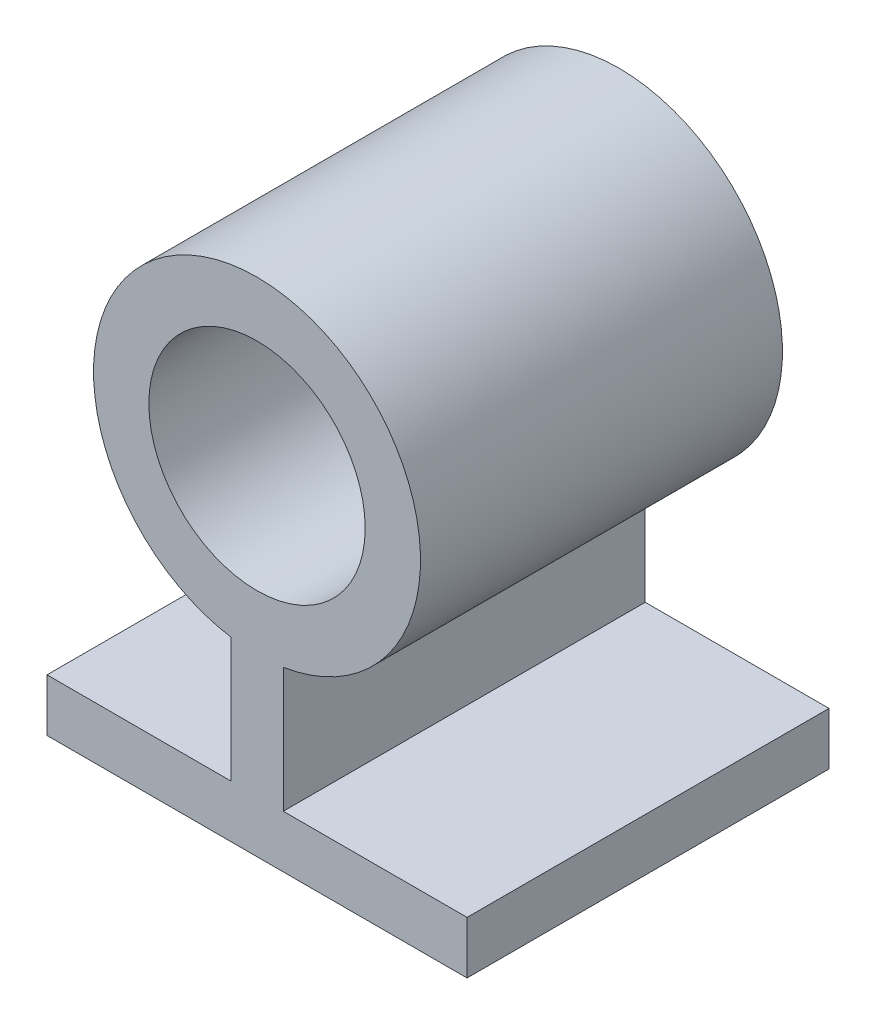
ISO-10303-21;
HEADER;
FILE_DESCRIPTION(('STEP AP214'),'2;1');
FILE_NAME('part.step','',(''),(''),'','','');
FILE_SCHEMA(('AUTOMOTIVE_DESIGN { 1 0 10303 214 1 1 1 1 }'));
ENDSEC;
DATA;
#1=APPLICATION_CONTEXT('core data for automotive mechanical design processes');
#2=APPLICATION_PROTOCOL_DEFINITION('international standard','automotive_design',2000,#1);
#3=PRODUCT_CONTEXT('',#1,'mechanical');
#4=PRODUCT('Part','Part','',(#3));
#5=PRODUCT_RELATED_PRODUCT_CATEGORY('part','',(#4));
#6=PRODUCT_DEFINITION_FORMATION('','',#4);
#7=PRODUCT_DEFINITION_CONTEXT('part definition',#1,'design');
#8=PRODUCT_DEFINITION('design','',#6,#7);
#9=PRODUCT_DEFINITION_SHAPE('','',#8);
#10=(LENGTH_UNIT() NAMED_UNIT(*) SI_UNIT(.MILLI.,.METRE.));
#11=(NAMED_UNIT(*) PLANE_ANGLE_UNIT() SI_UNIT($,.RADIAN.));
#12=(NAMED_UNIT(*) SI_UNIT($,.STERADIAN.) SOLID_ANGLE_UNIT());
#13=UNCERTAINTY_MEASURE_WITH_UNIT(LENGTH_MEASURE(1.E-05),#10,'distance_accuracy_value','');
#14=(GEOMETRIC_REPRESENTATION_CONTEXT(3) GLOBAL_UNCERTAINTY_ASSIGNED_CONTEXT((#13)) GLOBAL_UNIT_ASSIGNED_CONTEXT((#10,
#11,#12)) REPRESENTATION_CONTEXT('',''));
#15=CARTESIAN_POINT('',(0.,0.,0.));
#16=DIRECTION('',(0.,0.,1.));
#17=DIRECTION('',(1.,0.,0.));
#18=AXIS2_PLACEMENT_3D('',#15,#16,#17);
#19=CARTESIAN_POINT('',(0.,0.00125729107634131,-0.132602632502468));
#20=DIRECTION('',(0.,0.,1.));
#21=DIRECTION('',(1.,0.,0.));
#22=AXIS2_PLACEMENT_3D('',#19,#20,#21);
#23=CYLINDRICAL_SURFACE('',#22,3.14665);
#24=CARTESIAN_POINT('',(0.,0.00125729107634131,0.));
#25=DIRECTION('',(0.,0.,1.));
#26=DIRECTION('',(1.,0.,0.));
#27=AXIS2_PLACEMENT_3D('',#24,#25,#26);
#28=CIRCLE('',#27,3.14665);
#29=CARTESIAN_POINT('',(2.88708834641408,-1.25019270892366,0.));
#30=VERTEX_POINT('',#29);
#31=CARTESIAN_POINT('',(0.594395678399493,-3.08874270892366,0.));
#32=VERTEX_POINT('',#31);
#33=EDGE_CURVE('E365',#30,#32,#28,.F.);
#34=ORIENTED_EDGE('',*,*,#33,.T.);
#35=DIRECTION('',(0.,0.,1.));
#36=VECTOR('',#35,1.);
#37=CARTESIAN_POINT('',(0.594395678399493,-3.08874270892366,-0.132602632502468));
#38=LINE('',#37,#36);
#39=CARTESIAN_POINT('',(0.594395678399493,-3.08874270892366,3.52389736749753));
#40=VERTEX_POINT('',#39);
#41=EDGE_CURVE('E233',#32,#40,#38,.T.);
#42=ORIENTED_EDGE('',*,*,#41,.T.);
#43=CARTESIAN_POINT('',(0.,0.00125729107634131,3.52389736749753));
#44=DIRECTION('',(0.,0.,-1.));
#45=DIRECTION('',(-1.,0.,0.));
#46=AXIS2_PLACEMENT_3D('',#43,#44,#45);
#47=CIRCLE('',#46,3.14665);
#48=CARTESIAN_POINT('',(-0.594395678399496,-3.08874270892366,3.52389736749753));
#49=VERTEX_POINT('',#48);
#50=EDGE_CURVE('E380',#49,#40,#47,.T.);
#51=ORIENTED_EDGE('',*,*,#50,.F.);
#52=DIRECTION('',(0.,0.,1.));
#53=VECTOR('',#52,1.);
#54=CARTESIAN_POINT('',(-0.594395678399496,-3.08874270892366,-0.132602632502468));
#55=LINE('',#54,#53);
#56=CARTESIAN_POINT('',(-0.594395678399496,-3.08874270892366,0.));
#57=VERTEX_POINT('',#56);
#58=EDGE_CURVE('E236',#49,#57,#55,.F.);
#59=ORIENTED_EDGE('',*,*,#58,.T.);
#60=CARTESIAN_POINT('',(-2.88708834641408,-1.25019270892366,0.));
#61=VERTEX_POINT('',#60);
#62=EDGE_CURVE('E363',#57,#61,#28,.F.);
#63=ORIENTED_EDGE('',*,*,#62,.T.);
#64=DIRECTION('',(0.,0.,1.));
#65=VECTOR('',#64,1.);
#66=CARTESIAN_POINT('',(-2.88708834641408,-1.25019270892366,-0.132602632502468));
#67=LINE('',#66,#65);
#68=CARTESIAN_POINT('',(-2.88708834641408,-1.25019270892366,2.64839736749753));
#69=VERTEX_POINT('',#68);
#70=EDGE_CURVE('E388',#61,#69,#67,.T.);
#71=ORIENTED_EDGE('',*,*,#70,.T.);
#72=CARTESIAN_POINT('',(0.,0.00125729107634131,2.64839736749753));
#73=DIRECTION('',(0.,0.,1.));
#74=DIRECTION('',(1.,0.,0.));
#75=AXIS2_PLACEMENT_3D('',#72,#73,#74);
#76=CIRCLE('',#75,3.14665);
#77=CARTESIAN_POINT('',(-3.10674363602793,0.500807291076341,2.64839736749753));
#78=VERTEX_POINT('',#77);
#79=EDGE_CURVE('E356',#78,#69,#76,.T.);
#80=ORIENTED_EDGE('',*,*,#79,.F.);
#81=DIRECTION('',(0.,0.,1.));
#82=VECTOR('',#81,1.);
#83=CARTESIAN_POINT('',(-3.10674363602793,0.500807291076341,-0.132602632502468));
#84=LINE('',#83,#82);
#85=CARTESIAN_POINT('',(-3.10674363602793,0.500807291076341,0.));
#86=VERTEX_POINT('',#85);
#87=EDGE_CURVE('E383',#86,#78,#84,.T.);
#88=ORIENTED_EDGE('',*,*,#87,.F.);
#89=CARTESIAN_POINT('',(3.10674363602792,0.500807291076341,0.));
#90=VERTEX_POINT('',#89);
#91=EDGE_CURVE('E361',#86,#90,#28,.F.);
#92=ORIENTED_EDGE('',*,*,#91,.T.);
#93=DIRECTION('',(0.,0.,1.));
#94=VECTOR('',#93,1.);
#95=CARTESIAN_POINT('',(3.10674363602792,0.500807291076341,-0.132602632502468));
#96=LINE('',#95,#94);
#97=CARTESIAN_POINT('',(3.10674363602792,0.500807291076341,2.64839736749753));
#98=VERTEX_POINT('',#97);
#99=EDGE_CURVE('E385',#98,#90,#96,.F.);
#100=ORIENTED_EDGE('',*,*,#99,.F.);
#101=CARTESIAN_POINT('',(2.88708834641408,-1.25019270892366,2.64839736749753));
#102=VERTEX_POINT('',#101);
#103=EDGE_CURVE('E376',#102,#98,#76,.T.);
#104=ORIENTED_EDGE('',*,*,#103,.F.);
#105=DIRECTION('',(0.,0.,1.));
#106=VECTOR('',#105,1.);
#107=CARTESIAN_POINT('',(2.88708834641408,-1.25019270892366,-0.132602632502468));
#108=LINE('',#107,#106);
#109=EDGE_CURVE('E390',#102,#30,#108,.F.);
#110=ORIENTED_EDGE('',*,*,#109,.T.);
#111=EDGE_LOOP('',(#34,#42,#51,#59,#63,#71,#80,#88,#92,#100,#104,#110));
#112=FACE_BOUND('',#111,.T.);
#113=ADVANCED_FACE('F33',(#112),#23,.F.);
#114=CARTESIAN_POINT('',(0.,0.00125729107634131,3.52389736749753));
#115=DIRECTION('',(0.,0.,-1.));
#116=DIRECTION('',(-1.,0.,0.));
#117=AXIS2_PLACEMENT_3D('',#114,#115,#116);
#118=PLANE('',#117);
#119=ORIENTED_EDGE('',*,*,#50,.T.);
#120=DIRECTION('',(-1.,0.,0.));
#121=VECTOR('',#120,1.);
#122=CARTESIAN_POINT('',(0.,-3.08874270892366,3.52389736749753));
#123=LINE('',#122,#121);
#124=CARTESIAN_POINT('',(0.0881389702171581,-3.08874270892366,3.52389736749753));
#125=VERTEX_POINT('',#124);
#126=EDGE_CURVE('E230',#40,#125,#123,.T.);
#127=ORIENTED_EDGE('',*,*,#126,.T.);
#128=CARTESIAN_POINT('',(0.,0.,3.52389736749753));
#129=DIRECTION('',(0.,0.,-1.));
#130=DIRECTION('',(-1.,0.,0.));
#131=AXIS2_PLACEMENT_3D('',#128,#129,#130);
#132=CIRCLE('',#131,3.09);
#133=CARTESIAN_POINT('',(-0.0881389702171581,-3.08874270892366,3.52389736749753));
#134=VERTEX_POINT('',#133);
#135=EDGE_CURVE('E268',#134,#125,#132,.T.);
#136=ORIENTED_EDGE('',*,*,#135,.F.);
#137=EDGE_CURVE('E234',#134,#49,#123,.T.);
#138=ORIENTED_EDGE('',*,*,#137,.T.);
#139=EDGE_LOOP('',(#119,#127,#136,#138));
#140=FACE_BOUND('',#139,.T.);
#141=ADVANCED_FACE('F296',(#140),#118,.T.);
#142=CARTESIAN_POINT('',(0.,0.,13.4585371829633));
#143=DIRECTION('',(0.,0.,-1.));
#144=DIRECTION('',(-1.,0.,0.));
#145=AXIS2_PLACEMENT_3D('',#142,#143,#144);
#146=CYLINDRICAL_SURFACE('',#145,3.09);
#147=DIRECTION('',(0.,0.,-1.));
#148=VECTOR('',#147,1.);
#149=CARTESIAN_POINT('',(-0.0881389702171581,-3.08874270892366,13.4585371829633));
#150=LINE('',#149,#148);
#151=CARTESIAN_POINT('',(-0.0881300154276128,-3.08842864163243,4.71869736749753));
#152=VERTEX_POINT('',#151);
#153=EDGE_CURVE('E11',#134,#152,#150,.F.);
#154=ORIENTED_EDGE('',*,*,#153,.F.);
#155=ORIENTED_EDGE('',*,*,#135,.T.);
#156=DIRECTION('',(0.,0.,-1.));
#157=VECTOR('',#156,1.);
#158=CARTESIAN_POINT('',(0.0881389702171581,-3.08874270892366,13.4585371829633));
#159=LINE('',#158,#157);
#160=CARTESIAN_POINT('',(0.0881300154276159,-3.08842864163243,4.71869736749753));
#161=VERTEX_POINT('',#160);
#162=EDGE_CURVE('E42',#161,#125,#159,.T.);
#163=ORIENTED_EDGE('',*,*,#162,.F.);
#164=CARTESIAN_POINT('',(0.,0.,4.71869736749753));
#165=DIRECTION('',(0.,0.,1.));
#166=DIRECTION('',(0.0285239409404128,-0.999593109616722,0.));
#167=AXIS2_PLACEMENT_3D('',#164,#165,#166);
#168=CIRCLE('',#167,3.09);
#169=CARTESIAN_POINT('',(3.08999993605255,0.000628645542442329,4.71869736749753));
#170=VERTEX_POINT('',#169);
#171=EDGE_CURVE('E316',#161,#170,#168,.T.);
#172=ORIENTED_EDGE('',*,*,#171,.T.);
#173=CARTESIAN_POINT('',(0.,0.00125729107634131,4.71869736749753));
#174=DIRECTION('',(0.,0.,-1.));
#175=DIRECTION('',(-0.999999979305033,-0.000203445159366348,0.));
#176=AXIS2_PLACEMENT_3D('',#173,#174,#175);
#177=CIRCLE('',#176,3.09);
#178=CARTESIAN_POINT('',(-3.08999993605256,0.000628645533898983,4.71869736749753));
#179=VERTEX_POINT('',#178);
#180=EDGE_CURVE('E241',#179,#170,#177,.T.);
#181=ORIENTED_EDGE('',*,*,#180,.F.);
#182=CARTESIAN_POINT('',(0.,0.,4.71869736749753));
#183=DIRECTION('',(0.,0.,1.));
#184=DIRECTION('',(-0.999999979305034,0.000203445156601847,0.));
#185=AXIS2_PLACEMENT_3D('',#182,#183,#184);
#186=CIRCLE('',#185,3.09);
#187=EDGE_CURVE('E379',#179,#152,#186,.T.);
#188=ORIENTED_EDGE('',*,*,#187,.T.);
#189=EDGE_LOOP('',(#154,#155,#163,#172,#181,#188));
#190=FACE_BOUND('',#189,.T.);
#191=ADVANCED_FACE('F286',(#190),#146,.F.);
#192=CARTESIAN_POINT('',(0.,0.,10.34));
#193=DIRECTION('',(0.,0.,-1.));
#194=DIRECTION('',(-1.,0.,0.));
#195=AXIS2_PLACEMENT_3D('',#192,#193,#194);
#196=CYLINDRICAL_SURFACE('',#195,4.67);
#197=CARTESIAN_POINT('',(0.,0.,10.34));
#198=DIRECTION('',(0.,0.,1.));
#199=DIRECTION('',(1.,0.,0.));
#200=AXIS2_PLACEMENT_3D('',#197,#198,#199);
#201=CIRCLE('',#200,4.67);
#202=CARTESIAN_POINT('',(0.75,-4.60938173728321,10.34));
#203=VERTEX_POINT('',#202);
#204=CARTESIAN_POINT('',(-0.75,-4.60938173728321,10.34));
#205=VERTEX_POINT('',#204);
#206=EDGE_CURVE('E49',#203,#205,#201,.T.);
#207=ORIENTED_EDGE('',*,*,#206,.F.);
#208=DIRECTION('',(0.,0.,-1.));
#209=VECTOR('',#208,1.);
#210=CARTESIAN_POINT('',(0.75,-4.60938173728321,10.34));
#211=LINE('',#210,#209);
#212=CARTESIAN_POINT('',(0.75,-4.60938173728321,0.));
#213=VERTEX_POINT('',#212);
#214=EDGE_CURVE('E239',#203,#213,#211,.T.);
#215=ORIENTED_EDGE('',*,*,#214,.T.);
#216=CARTESIAN_POINT('',(0.,0.,0.));
#217=DIRECTION('',(0.,0.,1.));
#218=DIRECTION('',(1.,0.,0.));
#219=AXIS2_PLACEMENT_3D('',#216,#217,#218);
#220=CIRCLE('',#219,4.67);
#221=CARTESIAN_POINT('',(-0.75,-4.60938173728321,0.));
#222=VERTEX_POINT('',#221);
#223=EDGE_CURVE('E355',#213,#222,#220,.T.);
#224=ORIENTED_EDGE('',*,*,#223,.T.);
#225=DIRECTION('',(0.,0.,-1.));
#226=VECTOR('',#225,1.);
#227=CARTESIAN_POINT('',(-0.75,-4.60938173728321,10.34));
#228=LINE('',#227,#226);
#229=EDGE_CURVE('E54',#205,#222,#228,.T.);
#230=ORIENTED_EDGE('',*,*,#229,.F.);
#231=EDGE_LOOP('',(#207,#215,#224,#230));
#232=FACE_BOUND('',#231,.T.);
#233=ADVANCED_FACE('F35',(#232),#196,.T.);
#234=CARTESIAN_POINT('',(0.,0.,10.34));
#235=DIRECTION('',(0.,0.,1.));
#236=DIRECTION('',(1.,0.,0.));
#237=AXIS2_PLACEMENT_3D('',#234,#235,#236);
#238=PLANE('',#237);
#239=CARTESIAN_POINT('',(0.,0.00125729107634131,10.34));
#240=DIRECTION('',(0.,0.,1.));
#241=DIRECTION('',(1.,0.,0.));
#242=AXIS2_PLACEMENT_3D('',#239,#240,#241);
#243=CIRCLE('',#242,3.09);
#244=CARTESIAN_POINT('',(3.09,0.00125729107634131,10.34));
#245=VERTEX_POINT('',#244);
#246=EDGE_CURVE('E352',#245,#245,#243,.F.);
#247=ORIENTED_EDGE('',*,*,#246,.T.);
#248=EDGE_LOOP('',(#247));
#249=FACE_BOUND('',#248,.T.);
#250=ORIENTED_EDGE('',*,*,#206,.T.);
#251=DIRECTION('',(0.,1.,0.));
#252=VECTOR('',#251,1.);
#253=CARTESIAN_POINT('',(-0.75,0.,10.34));
#254=LINE('',#253,#252);
#255=CARTESIAN_POINT('',(-0.75,-8.17,10.34));
#256=VERTEX_POINT('',#255);
#257=EDGE_CURVE('E183',#256,#205,#254,.T.);
#258=ORIENTED_EDGE('',*,*,#257,.F.);
#259=DIRECTION('',(1.,0.,0.));
#260=VECTOR('',#259,1.);
#261=CARTESIAN_POINT('',(0.,-8.17,10.34));
#262=LINE('',#261,#260);
#263=CARTESIAN_POINT('',(-6.,-8.17,10.34));
#264=VERTEX_POINT('',#263);
#265=EDGE_CURVE('E193',#264,#256,#262,.T.);
#266=ORIENTED_EDGE('',*,*,#265,.F.);
#267=DIRECTION('',(0.,-1.,0.));
#268=VECTOR('',#267,1.);
#269=CARTESIAN_POINT('',(-6.00000000000001,0.,10.34));
#270=LINE('',#269,#268);
#271=CARTESIAN_POINT('',(-6.,-9.67,10.34));
#272=VERTEX_POINT('',#271);
#273=EDGE_CURVE('E199',#264,#272,#270,.T.);
#274=ORIENTED_EDGE('',*,*,#273,.T.);
#275=DIRECTION('',(1.,0.,0.));
#276=VECTOR('',#275,1.);
#277=CARTESIAN_POINT('',(0.,-9.67,10.34));
#278=LINE('',#277,#276);
#279=CARTESIAN_POINT('',(6.,-9.67,10.34));
#280=VERTEX_POINT('',#279);
#281=EDGE_CURVE('E208',#272,#280,#278,.T.);
#282=ORIENTED_EDGE('',*,*,#281,.T.);
#283=DIRECTION('',(0.,-1.,0.));
#284=VECTOR('',#283,1.);
#285=CARTESIAN_POINT('',(6.,0.,10.34));
#286=LINE('',#285,#284);
#287=CARTESIAN_POINT('',(6.,-8.17,10.34));
#288=VERTEX_POINT('',#287);
#289=EDGE_CURVE('E211',#288,#280,#286,.T.);
#290=ORIENTED_EDGE('',*,*,#289,.F.);
#291=DIRECTION('',(1.,0.,0.));
#292=VECTOR('',#291,1.);
#293=CARTESIAN_POINT('',(0.,-8.17,10.34));
#294=LINE('',#293,#292);
#295=CARTESIAN_POINT('',(0.75,-8.17,10.34));
#296=VERTEX_POINT('',#295);
#297=EDGE_CURVE('E214',#296,#288,#294,.T.);
#298=ORIENTED_EDGE('',*,*,#297,.F.);
#299=DIRECTION('',(0.,1.,0.));
#300=VECTOR('',#299,1.);
#301=CARTESIAN_POINT('',(0.75,0.,10.34));
#302=LINE('',#301,#300);
#303=EDGE_CURVE('E190',#296,#203,#302,.T.);
#304=ORIENTED_EDGE('',*,*,#303,.T.);
#305=EDGE_LOOP('',(#250,#258,#266,#274,#282,#290,#298,#304));
#306=FACE_BOUND('',#305,.T.);
#307=ADVANCED_FACE('F201',(#249,#306),#238,.T.);
#308=CARTESIAN_POINT('',(0.,0.,0.));
#309=DIRECTION('',(0.,0.,1.));
#310=DIRECTION('',(1.,0.,0.));
#311=AXIS2_PLACEMENT_3D('',#308,#309,#310);
#312=PLANE('',#311);
#313=ORIENTED_EDGE('',*,*,#62,.F.);
#314=DIRECTION('',(-1.,0.,0.));
#315=VECTOR('',#314,1.);
#316=CARTESIAN_POINT('',(0.,-3.08874270892366,0.));
#317=LINE('',#316,#315);
#318=EDGE_CURVE('E678',#32,#57,#317,.T.);
#319=ORIENTED_EDGE('',*,*,#318,.F.);
#320=ORIENTED_EDGE('',*,*,#33,.F.);
#321=DIRECTION('',(-1.,0.,0.));
#322=VECTOR('',#321,1.);
#323=CARTESIAN_POINT('',(0.,-1.25019270892366,0.));
#324=LINE('',#323,#322);
#325=CARTESIAN_POINT('',(3.2651,-1.25019270892366,0.));
#326=VERTEX_POINT('',#325);
#327=EDGE_CURVE('E372',#326,#30,#324,.T.);
#328=ORIENTED_EDGE('',*,*,#327,.F.);
#329=DIRECTION('',(0.,1.,0.));
#330=VECTOR('',#329,1.);
#331=CARTESIAN_POINT('',(3.2651,0.,0.));
#332=LINE('',#331,#330);
#333=CARTESIAN_POINT('',(3.2651,0.500807291076341,0.));
#334=VERTEX_POINT('',#333);
#335=EDGE_CURVE('E357',#326,#334,#332,.T.);
#336=ORIENTED_EDGE('',*,*,#335,.T.);
#337=DIRECTION('',(-1.,0.,0.));
#338=VECTOR('',#337,1.);
#339=CARTESIAN_POINT('',(0.,0.500807291076341,0.));
#340=LINE('',#339,#338);
#341=EDGE_CURVE('E360',#334,#90,#340,.T.);
#342=ORIENTED_EDGE('',*,*,#341,.T.);
#343=ORIENTED_EDGE('',*,*,#91,.F.);
#344=CARTESIAN_POINT('',(-3.2651,0.500807291076341,0.));
#345=VERTEX_POINT('',#344);
#346=EDGE_CURVE('E364',#86,#345,#340,.T.);
#347=ORIENTED_EDGE('',*,*,#346,.T.);
#348=DIRECTION('',(0.,1.,0.));
#349=VECTOR('',#348,1.);
#350=CARTESIAN_POINT('',(-3.2651,0.,0.));
#351=LINE('',#350,#349);
#352=CARTESIAN_POINT('',(-3.2651,-1.25019270892366,0.));
#353=VERTEX_POINT('',#352);
#354=EDGE_CURVE('E371',#353,#345,#351,.T.);
#355=ORIENTED_EDGE('',*,*,#354,.F.);
#356=EDGE_CURVE('E368',#61,#353,#324,.T.);
#357=ORIENTED_EDGE('',*,*,#356,.F.);
#358=EDGE_LOOP('',(#313,#319,#320,#328,#336,#342,#343,#347,#355,#357));
#359=FACE_BOUND('',#358,.T.);
#360=ORIENTED_EDGE('',*,*,#223,.F.);
#361=DIRECTION('',(0.,-1.,0.));
#362=VECTOR('',#361,1.);
#363=CARTESIAN_POINT('',(0.75,0.,0.));
#364=LINE('',#363,#362);
#365=CARTESIAN_POINT('',(0.75,-8.17,0.));
#366=VERTEX_POINT('',#365);
#367=EDGE_CURVE('E673',#213,#366,#364,.T.);
#368=ORIENTED_EDGE('',*,*,#367,.T.);
#369=DIRECTION('',(-1.,0.,0.));
#370=VECTOR('',#369,1.);
#371=CARTESIAN_POINT('',(0.,-8.17,0.));
#372=LINE('',#371,#370);
#373=CARTESIAN_POINT('',(6.,-8.17,0.));
#374=VERTEX_POINT('',#373);
#375=EDGE_CURVE('E665',#374,#366,#372,.T.);
#376=ORIENTED_EDGE('',*,*,#375,.F.);
#377=DIRECTION('',(0.,1.,0.));
#378=VECTOR('',#377,1.);
#379=CARTESIAN_POINT('',(6.,0.,0.));
#380=LINE('',#379,#378);
#381=CARTESIAN_POINT('',(6.,-9.67,0.));
#382=VERTEX_POINT('',#381);
#383=EDGE_CURVE('E669',#382,#374,#380,.T.);
#384=ORIENTED_EDGE('',*,*,#383,.F.);
#385=DIRECTION('',(-1.,0.,0.));
#386=VECTOR('',#385,1.);
#387=CARTESIAN_POINT('',(0.,-9.67,0.));
#388=LINE('',#387,#386);
#389=CARTESIAN_POINT('',(-6.,-9.67,0.));
#390=VERTEX_POINT('',#389);
#391=EDGE_CURVE('E671',#382,#390,#388,.T.);
#392=ORIENTED_EDGE('',*,*,#391,.T.);
#393=DIRECTION('',(0.,1.,0.));
#394=VECTOR('',#393,1.);
#395=CARTESIAN_POINT('',(-6.00000000000001,0.,0.));
#396=LINE('',#395,#394);
#397=CARTESIAN_POINT('',(-6.,-8.17,0.));
#398=VERTEX_POINT('',#397);
#399=EDGE_CURVE('E229',#390,#398,#396,.T.);
#400=ORIENTED_EDGE('',*,*,#399,.T.);
#401=DIRECTION('',(-1.,0.,0.));
#402=VECTOR('',#401,1.);
#403=CARTESIAN_POINT('',(0.,-8.17,0.));
#404=LINE('',#403,#402);
#405=CARTESIAN_POINT('',(-0.75,-8.17,0.));
#406=VERTEX_POINT('',#405);
#407=EDGE_CURVE('E220',#406,#398,#404,.T.);
#408=ORIENTED_EDGE('',*,*,#407,.F.);
#409=DIRECTION('',(0.,-1.,0.));
#410=VECTOR('',#409,1.);
#411=CARTESIAN_POINT('',(-0.75,0.,0.));
#412=LINE('',#411,#410);
#413=EDGE_CURVE('E185',#222,#406,#412,.T.);
#414=ORIENTED_EDGE('',*,*,#413,.F.);
#415=EDGE_LOOP('',(#360,#368,#376,#384,#392,#400,#408,#414));
#416=FACE_BOUND('',#415,.T.);
#417=ADVANCED_FACE('F431',(#359,#416),#312,.F.);
#418=CARTESIAN_POINT('',(7.90186074429301,0.500807291076341,4.71869736749753));
#419=DIRECTION('',(0.,1.,0.));
#420=DIRECTION('',(0.,0.,1.));
#421=AXIS2_PLACEMENT_3D('',#418,#419,#420);
#422=PLANE('',#421);
#423=DIRECTION('',(0.,0.,-1.));
#424=VECTOR('',#423,1.);
#425=CARTESIAN_POINT('',(3.2651,0.500807291076341,4.71869736749753));
#426=LINE('',#425,#424);
#427=CARTESIAN_POINT('',(3.2651,0.500807291076341,2.64839736749753));
#428=VERTEX_POINT('',#427);
#429=EDGE_CURVE('E403',#428,#334,#426,.T.);
#430=ORIENTED_EDGE('',*,*,#429,.F.);
#431=DIRECTION('',(1.,0.,0.));
#432=VECTOR('',#431,1.);
#433=CARTESIAN_POINT('',(7.90186074429301,0.500807291076341,2.64839736749753));
#434=LINE('',#433,#432);
#435=EDGE_CURVE('E275',#98,#428,#434,.T.);
#436=ORIENTED_EDGE('',*,*,#435,.F.);
#437=ORIENTED_EDGE('',*,*,#99,.T.);
#438=ORIENTED_EDGE('',*,*,#341,.F.);
#439=EDGE_LOOP('',(#430,#436,#437,#438));
#440=FACE_BOUND('',#439,.T.);
#441=ADVANCED_FACE('F453',(#440),#422,.F.);
#442=ORIENTED_EDGE('',*,*,#87,.T.);
#443=CARTESIAN_POINT('',(-3.2651,0.500807291076341,2.64839736749753));
#444=VERTEX_POINT('',#443);
#445=EDGE_CURVE('E406',#444,#78,#434,.T.);
#446=ORIENTED_EDGE('',*,*,#445,.F.);
#447=DIRECTION('',(0.,0.,-1.));
#448=VECTOR('',#447,1.);
#449=CARTESIAN_POINT('',(-3.2651,0.500807291076341,4.71869736749753));
#450=LINE('',#449,#448);
#451=EDGE_CURVE('E399',#444,#345,#450,.T.);
#452=ORIENTED_EDGE('',*,*,#451,.T.);
#453=ORIENTED_EDGE('',*,*,#346,.F.);
#454=EDGE_LOOP('',(#442,#446,#452,#453));
#455=FACE_BOUND('',#454,.T.);
#456=ADVANCED_FACE('F449',(#455),#422,.F.);
#457=CARTESIAN_POINT('',(7.90186074429301,-1.25019270892366,4.71869736749753));
#458=DIRECTION('',(0.,1.,0.));
#459=DIRECTION('',(0.,0.,1.));
#460=AXIS2_PLACEMENT_3D('',#457,#458,#459);
#461=PLANE('',#460);
#462=ORIENTED_EDGE('',*,*,#327,.T.);
#463=ORIENTED_EDGE('',*,*,#109,.F.);
#464=DIRECTION('',(1.,0.,0.));
#465=VECTOR('',#464,1.);
#466=CARTESIAN_POINT('',(7.90186074429301,-1.25019270892366,2.64839736749753));
#467=LINE('',#466,#465);
#468=CARTESIAN_POINT('',(3.2651,-1.25019270892366,2.64839736749753));
#469=VERTEX_POINT('',#468);
#470=EDGE_CURVE('E402',#102,#469,#467,.T.);
#471=ORIENTED_EDGE('',*,*,#470,.T.);
#472=DIRECTION('',(0.,0.,-1.));
#473=VECTOR('',#472,1.);
#474=CARTESIAN_POINT('',(3.2651,-1.25019270892366,4.71869736749753));
#475=LINE('',#474,#473);
#476=EDGE_CURVE('E409',#469,#326,#475,.T.);
#477=ORIENTED_EDGE('',*,*,#476,.T.);
#478=EDGE_LOOP('',(#462,#463,#471,#477));
#479=FACE_BOUND('',#478,.T.);
#480=ADVANCED_FACE('F298',(#479),#461,.T.);
#481=ORIENTED_EDGE('',*,*,#356,.T.);
#482=DIRECTION('',(0.,0.,-1.));
#483=VECTOR('',#482,1.);
#484=CARTESIAN_POINT('',(-3.2651,-1.25019270892366,4.71869736749753));
#485=LINE('',#484,#483);
#486=CARTESIAN_POINT('',(-3.2651,-1.25019270892366,2.64839736749753));
#487=VERTEX_POINT('',#486);
#488=EDGE_CURVE('E397',#487,#353,#485,.T.);
#489=ORIENTED_EDGE('',*,*,#488,.F.);
#490=EDGE_CURVE('E304',#487,#69,#467,.T.);
#491=ORIENTED_EDGE('',*,*,#490,.T.);
#492=ORIENTED_EDGE('',*,*,#70,.F.);
#493=EDGE_LOOP('',(#481,#489,#491,#492));
#494=FACE_BOUND('',#493,.T.);
#495=ADVANCED_FACE('F443',(#494),#461,.T.);
#496=CARTESIAN_POINT('',(3.2651,-1.25019270892366,4.71869736749753));
#497=DIRECTION('',(1.,0.,0.));
#498=DIRECTION('',(0.,0.,-1.));
#499=AXIS2_PLACEMENT_3D('',#496,#497,#498);
#500=PLANE('',#499);
#501=ORIENTED_EDGE('',*,*,#476,.F.);
#502=DIRECTION('',(0.,1.,0.));
#503=VECTOR('',#502,1.);
#504=CARTESIAN_POINT('',(3.2651,-1.25019270892366,2.64839736749753));
#505=LINE('',#504,#503);
#506=EDGE_CURVE('E394',#469,#428,#505,.T.);
#507=ORIENTED_EDGE('',*,*,#506,.T.);
#508=ORIENTED_EDGE('',*,*,#429,.T.);
#509=ORIENTED_EDGE('',*,*,#335,.F.);
#510=EDGE_LOOP('',(#501,#507,#508,#509));
#511=FACE_BOUND('',#510,.T.);
#512=ADVANCED_FACE('F427',(#511),#500,.F.);
#513=CARTESIAN_POINT('',(-3.2651,-1.25019270892366,4.71869736749753));
#514=DIRECTION('',(1.,0.,0.));
#515=DIRECTION('',(0.,0.,-1.));
#516=AXIS2_PLACEMENT_3D('',#513,#514,#515);
#517=PLANE('',#516);
#518=ORIENTED_EDGE('',*,*,#354,.T.);
#519=ORIENTED_EDGE('',*,*,#451,.F.);
#520=DIRECTION('',(0.,1.,0.));
#521=VECTOR('',#520,1.);
#522=CARTESIAN_POINT('',(-3.2651,-1.25019270892366,2.64839736749753));
#523=LINE('',#522,#521);
#524=EDGE_CURVE('E393',#487,#444,#523,.T.);
#525=ORIENTED_EDGE('',*,*,#524,.F.);
#526=ORIENTED_EDGE('',*,*,#488,.T.);
#527=EDGE_LOOP('',(#518,#519,#525,#526));
#528=FACE_BOUND('',#527,.T.);
#529=ADVANCED_FACE('F340',(#528),#517,.T.);
#530=CARTESIAN_POINT('',(0.,0.00125729107634131,10.5175973674975));
#531=DIRECTION('',(0.,0.,-1.));
#532=DIRECTION('',(-1.,0.,0.));
#533=AXIS2_PLACEMENT_3D('',#530,#531,#532);
#534=CYLINDRICAL_SURFACE('',#533,3.09);
#535=CARTESIAN_POINT('',(0.,-3.08874270892366,4.71869736749753));
#536=DIRECTION('',(1.,0.,0.));
#537=VECTOR('',#536,1.);
#538=LINE('',#535,#537);
#539=CARTESIAN_POINT('',(0.,-3.08905703169274,4.71869736749753));
#540=VERTEX_POINT('',#539);
#541=EDGE_CURVE('E683',#540,#161,#538,.T.);
#542=ORIENTED_EDGE('',*,*,#541,.F.);
#543=CARTESIAN_POINT('',(-0.0881389775058691,-3.08874270892366,4.71869736749753));
#544=DIRECTION('',(1.,0.,0.));
#545=VECTOR('',#544,1.);
#546=LINE('',#543,#545);
#547=EDGE_CURVE('E246',#152,#540,#546,.T.);
#548=ORIENTED_EDGE('',*,*,#547,.F.);
#549=ORIENTED_EDGE('',*,*,#187,.F.);
#550=ORIENTED_EDGE('',*,*,#180,.T.);
#551=ORIENTED_EDGE('',*,*,#171,.F.);
#552=EDGE_LOOP('',(#542,#548,#549,#550,#551));
#553=FACE_BOUND('',#552,.T.);
#554=ORIENTED_EDGE('',*,*,#246,.F.);
#555=EDGE_LOOP('',(#554));
#556=FACE_BOUND('',#555,.T.);
#557=ADVANCED_FACE('F329',(#553,#556),#534,.F.);
#558=CARTESIAN_POINT('',(7.90186074429301,-1.25019270892366,2.64839736749753));
#559=DIRECTION('',(0.,0.,1.));
#560=DIRECTION('',(1.,0.,0.));
#561=AXIS2_PLACEMENT_3D('',#558,#559,#560);
#562=PLANE('',#561);
#563=ORIENTED_EDGE('',*,*,#79,.T.);
#564=ORIENTED_EDGE('',*,*,#490,.F.);
#565=ORIENTED_EDGE('',*,*,#524,.T.);
#566=ORIENTED_EDGE('',*,*,#445,.T.);
#567=EDGE_LOOP('',(#563,#564,#565,#566));
#568=FACE_BOUND('',#567,.T.);
#569=ADVANCED_FACE('F339',(#568),#562,.F.);
#570=ORIENTED_EDGE('',*,*,#103,.T.);
#571=ORIENTED_EDGE('',*,*,#435,.T.);
#572=ORIENTED_EDGE('',*,*,#506,.F.);
#573=ORIENTED_EDGE('',*,*,#470,.F.);
#574=EDGE_LOOP('',(#570,#571,#572,#573));
#575=FACE_BOUND('',#574,.T.);
#576=ADVANCED_FACE('F262',(#575),#562,.F.);
#577=CARTESIAN_POINT('',(0.,-3.08874270892366,-13.6862320428723));
#578=DIRECTION('',(0.,-1.,0.));
#579=DIRECTION('',(0.,0.,-1.));
#580=AXIS2_PLACEMENT_3D('',#577,#578,#579);
#581=PLANE('',#580);
#582=ORIENTED_EDGE('',*,*,#153,.T.);
#583=ORIENTED_EDGE('',*,*,#547,.T.);
#584=ORIENTED_EDGE('',*,*,#541,.T.);
#585=ORIENTED_EDGE('',*,*,#162,.T.);
#586=ORIENTED_EDGE('',*,*,#126,.F.);
#587=ORIENTED_EDGE('',*,*,#41,.F.);
#588=ORIENTED_EDGE('',*,*,#318,.T.);
#589=ORIENTED_EDGE('',*,*,#58,.F.);
#590=ORIENTED_EDGE('',*,*,#137,.F.);
#591=EDGE_LOOP('',(#582,#583,#584,#585,#586,#587,#588,#589,#590));
#592=FACE_BOUND('',#591,.T.);
#593=ADVANCED_FACE('F252',(#592),#581,.F.);
#594=CARTESIAN_POINT('',(0.75,0.,-13.6862320428723));
#595=DIRECTION('',(1.,0.,0.));
#596=DIRECTION('',(0.,0.,-1.));
#597=AXIS2_PLACEMENT_3D('',#594,#595,#596);
#598=PLANE('',#597);
#599=ORIENTED_EDGE('',*,*,#214,.F.);
#600=ORIENTED_EDGE('',*,*,#303,.F.);
#601=DIRECTION('',(0.,0.,1.));
#602=VECTOR('',#601,1.);
#603=CARTESIAN_POINT('',(0.75,-8.17,-13.6862320428723));
#604=LINE('',#603,#602);
#605=EDGE_CURVE('E218',#366,#296,#604,.T.);
#606=ORIENTED_EDGE('',*,*,#605,.F.);
#607=ORIENTED_EDGE('',*,*,#367,.F.);
#608=EDGE_LOOP('',(#599,#600,#606,#607));
#609=FACE_BOUND('',#608,.T.);
#610=ADVANCED_FACE('F261',(#609),#598,.T.);
#611=CARTESIAN_POINT('',(-0.75,0.,-13.6862320428723));
#612=DIRECTION('',(1.,0.,0.));
#613=DIRECTION('',(0.,0.,-1.));
#614=AXIS2_PLACEMENT_3D('',#611,#612,#613);
#615=PLANE('',#614);
#616=ORIENTED_EDGE('',*,*,#257,.T.);
#617=ORIENTED_EDGE('',*,*,#229,.T.);
#618=ORIENTED_EDGE('',*,*,#413,.T.);
#619=DIRECTION('',(0.,0.,1.));
#620=VECTOR('',#619,1.);
#621=CARTESIAN_POINT('',(-0.75,-8.17,-13.6862320428723));
#622=LINE('',#621,#620);
#623=EDGE_CURVE('E179',#406,#256,#622,.T.);
#624=ORIENTED_EDGE('',*,*,#623,.T.);
#625=EDGE_LOOP('',(#616,#617,#618,#624));
#626=FACE_BOUND('',#625,.T.);
#627=ADVANCED_FACE('F181',(#626),#615,.F.);
#628=CARTESIAN_POINT('',(0.,-8.17,-13.6862320428723));
#629=DIRECTION('',(0.,-1.,0.));
#630=DIRECTION('',(0.,0.,-1.));
#631=AXIS2_PLACEMENT_3D('',#628,#629,#630);
#632=PLANE('',#631);
#633=ORIENTED_EDGE('',*,*,#623,.F.);
#634=ORIENTED_EDGE('',*,*,#407,.T.);
#635=DIRECTION('',(0.,0.,1.));
#636=VECTOR('',#635,1.);
#637=CARTESIAN_POINT('',(-6.,-8.17,-13.6862320428723));
#638=LINE('',#637,#636);
#639=EDGE_CURVE('E189',#398,#264,#638,.T.);
#640=ORIENTED_EDGE('',*,*,#639,.T.);
#641=ORIENTED_EDGE('',*,*,#265,.T.);
#642=EDGE_LOOP('',(#633,#634,#640,#641));
#643=FACE_BOUND('',#642,.T.);
#644=ADVANCED_FACE('F194',(#643),#632,.F.);
#645=CARTESIAN_POINT('',(-6.00000000000001,0.,-13.6862320428723));
#646=DIRECTION('',(-1.,0.,0.));
#647=DIRECTION('',(0.,-1.,0.));
#648=AXIS2_PLACEMENT_3D('',#645,#646,#647);
#649=PLANE('',#648);
#650=ORIENTED_EDGE('',*,*,#399,.F.);
#651=DIRECTION('',(0.,0.,1.));
#652=VECTOR('',#651,1.);
#653=CARTESIAN_POINT('',(-6.,-9.67,-13.6862320428723));
#654=LINE('',#653,#652);
#655=EDGE_CURVE('E225',#390,#272,#654,.T.);
#656=ORIENTED_EDGE('',*,*,#655,.T.);
#657=ORIENTED_EDGE('',*,*,#273,.F.);
#658=ORIENTED_EDGE('',*,*,#639,.F.);
#659=EDGE_LOOP('',(#650,#656,#657,#658));
#660=FACE_BOUND('',#659,.T.);
#661=ADVANCED_FACE('F540',(#660),#649,.T.);
#662=CARTESIAN_POINT('',(0.,-9.67,-13.6862320428723));
#663=DIRECTION('',(0.,-1.,0.));
#664=DIRECTION('',(0.,0.,-1.));
#665=AXIS2_PLACEMENT_3D('',#662,#663,#664);
#666=PLANE('',#665);
#667=ORIENTED_EDGE('',*,*,#391,.F.);
#668=DIRECTION('',(0.,0.,1.));
#669=VECTOR('',#668,1.);
#670=CARTESIAN_POINT('',(6.,-9.67,-13.6862320428723));
#671=LINE('',#670,#669);
#672=EDGE_CURVE('E223',#382,#280,#671,.T.);
#673=ORIENTED_EDGE('',*,*,#672,.T.);
#674=ORIENTED_EDGE('',*,*,#281,.F.);
#675=ORIENTED_EDGE('',*,*,#655,.F.);
#676=EDGE_LOOP('',(#667,#673,#674,#675));
#677=FACE_BOUND('',#676,.T.);
#678=ADVANCED_FACE('F546',(#677),#666,.T.);
#679=CARTESIAN_POINT('',(6.,0.,-13.6862320428723));
#680=DIRECTION('',(-1.,0.,0.));
#681=DIRECTION('',(0.,0.,1.));
#682=AXIS2_PLACEMENT_3D('',#679,#680,#681);
#683=PLANE('',#682);
#684=ORIENTED_EDGE('',*,*,#672,.F.);
#685=ORIENTED_EDGE('',*,*,#383,.T.);
#686=DIRECTION('',(0.,0.,1.));
#687=VECTOR('',#686,1.);
#688=CARTESIAN_POINT('',(6.,-8.17,-13.6862320428723));
#689=LINE('',#688,#687);
#690=EDGE_CURVE('E221',#374,#288,#689,.T.);
#691=ORIENTED_EDGE('',*,*,#690,.T.);
#692=ORIENTED_EDGE('',*,*,#289,.T.);
#693=EDGE_LOOP('',(#684,#685,#691,#692));
#694=FACE_BOUND('',#693,.T.);
#695=ADVANCED_FACE('F554',(#694),#683,.F.);
#696=CARTESIAN_POINT('',(0.,-8.17,-13.6862320428723));
#697=DIRECTION('',(0.,-1.,0.));
#698=DIRECTION('',(0.,0.,-1.));
#699=AXIS2_PLACEMENT_3D('',#696,#697,#698);
#700=PLANE('',#699);
#701=ORIENTED_EDGE('',*,*,#690,.F.);
#702=ORIENTED_EDGE('',*,*,#375,.T.);
#703=ORIENTED_EDGE('',*,*,#605,.T.);
#704=ORIENTED_EDGE('',*,*,#297,.T.);
#705=EDGE_LOOP('',(#701,#702,#703,#704));
#706=FACE_BOUND('',#705,.T.);
#707=ADVANCED_FACE('F562',(#706),#700,.F.);
#708=CLOSED_SHELL('',(#113,#141,#191,#233,#307,#417,#441,#456,#480,#495,#512,#529,#557,#569,
#576,#593,#610,#627,#644,#661,#678,#695,#707));
#709=MANIFOLD_SOLID_BREP('B2',#708);
#710=ADVANCED_BREP_SHAPE_REPRESENTATION('',(#18,#709),#14);
#711=SHAPE_DEFINITION_REPRESENTATION(#9,#710);
ENDSEC;
END-ISO-10303-21;
